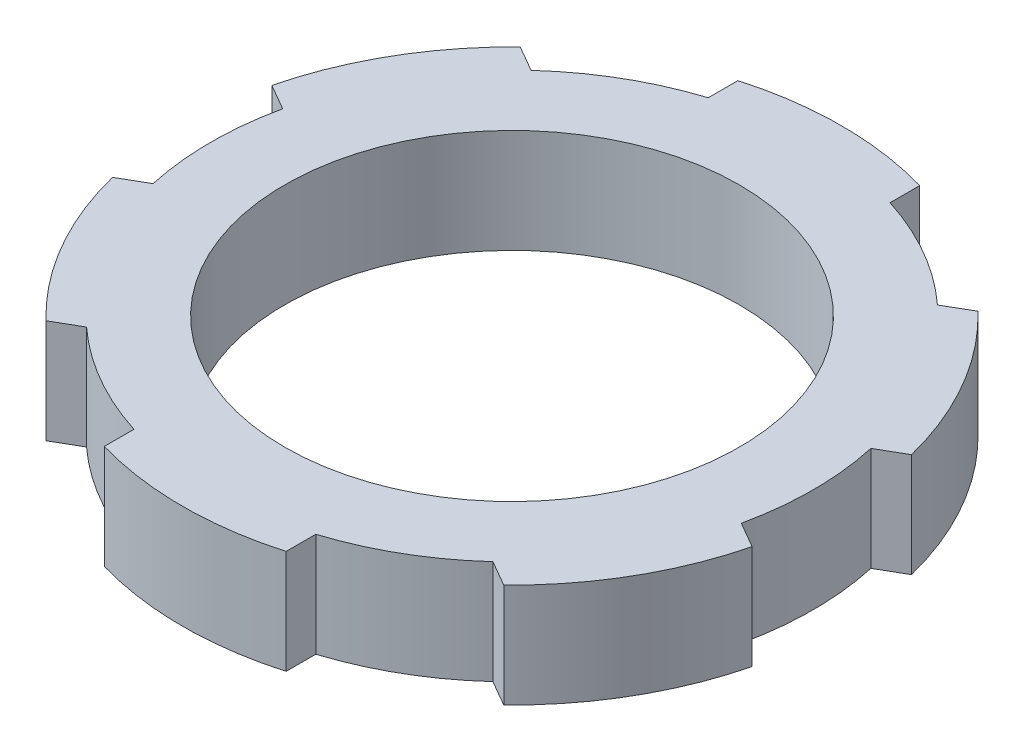
ISO-10303-21;
HEADER;
FILE_DESCRIPTION(('STEP AP214'),'2;1');
FILE_NAME('part.step','',(''),(''),'','','');
FILE_SCHEMA(('AUTOMOTIVE_DESIGN { 1 0 10303 214 1 1 1 1 }'));
ENDSEC;
DATA;
#1=APPLICATION_CONTEXT('core data for automotive mechanical design processes');
#2=APPLICATION_PROTOCOL_DEFINITION('international standard','automotive_design',2000,#1);
#3=PRODUCT_CONTEXT('',#1,'mechanical');
#4=PRODUCT('Part','Part','',(#3));
#5=PRODUCT_RELATED_PRODUCT_CATEGORY('part','',(#4));
#6=PRODUCT_DEFINITION_FORMATION('','',#4);
#7=PRODUCT_DEFINITION_CONTEXT('part definition',#1,'design');
#8=PRODUCT_DEFINITION('design','',#6,#7);
#9=PRODUCT_DEFINITION_SHAPE('','',#8);
#10=(LENGTH_UNIT() NAMED_UNIT(*) SI_UNIT(.MILLI.,.METRE.));
#11=(NAMED_UNIT(*) PLANE_ANGLE_UNIT() SI_UNIT($,.RADIAN.));
#12=(NAMED_UNIT(*) SI_UNIT($,.STERADIAN.) SOLID_ANGLE_UNIT());
#13=UNCERTAINTY_MEASURE_WITH_UNIT(LENGTH_MEASURE(1.E-05),#10,'distance_accuracy_value','');
#14=(GEOMETRIC_REPRESENTATION_CONTEXT(3) GLOBAL_UNCERTAINTY_ASSIGNED_CONTEXT((#13)) GLOBAL_UNIT_ASSIGNED_CONTEXT((#10,
#11,#12)) REPRESENTATION_CONTEXT('',''));
#15=CARTESIAN_POINT('',(0.,0.,0.));
#16=DIRECTION('',(0.,0.,1.));
#17=DIRECTION('',(1.,0.,0.));
#18=AXIS2_PLACEMENT_3D('',#15,#16,#17);
#19=CARTESIAN_POINT('',(0.,4.57199999999999,0.));
#20=DIRECTION('',(0.,-1.,0.));
#21=DIRECTION('',(0.,0.,-1.00000000000002));
#22=AXIS2_PLACEMENT_3D('',#19,#20,#21);
#23=CYLINDRICAL_SURFACE('',#22,13.25);
#24=CARTESIAN_POINT('',(0.,4.57199999999999,0.));
#25=DIRECTION('',(0.,1.,0.));
#26=DIRECTION('',(0.,0.,1.00000000000002));
#27=AXIS2_PLACEMENT_3D('',#24,#25,#26);
#28=CIRCLE('',#27,13.25);
#29=CARTESIAN_POINT('',(8.93946410936118,4.57199999999999,-9.78000416346832));
#30=VERTEX_POINT('',#29);
#31=CARTESIAN_POINT('',(4.00000000000025,4.57199999999999,-12.6318050966599));
#32=VERTEX_POINT('',#31);
#33=EDGE_CURVE('E46',#30,#32,#28,.T.);
#34=ORIENTED_EDGE('',*,*,#33,.F.);
#35=DIRECTION('',(0.,1.,0.));
#36=VECTOR('',#35,1.);
#37=CARTESIAN_POINT('',(8.93946410936118,-9.15394837083547,-9.78000416346832));
#38=LINE('',#37,#36);
#39=CARTESIAN_POINT('',(8.93946410936118,0.,-9.78000416346832));
#40=VERTEX_POINT('',#39);
#41=EDGE_CURVE('E230',#40,#30,#38,.T.);
#42=ORIENTED_EDGE('',*,*,#41,.F.);
#43=CARTESIAN_POINT('',(0.,0.,0.));
#44=DIRECTION('',(0.,1.,0.));
#45=DIRECTION('',(0.,0.,1.00000000000002));
#46=AXIS2_PLACEMENT_3D('',#43,#44,#45);
#47=CIRCLE('',#46,13.25);
#48=CARTESIAN_POINT('',(4.00000000000025,0.,-12.6318050966599));
#49=VERTEX_POINT('',#48);
#50=EDGE_CURVE('E364',#40,#49,#47,.T.);
#51=ORIENTED_EDGE('',*,*,#50,.T.);
#52=DIRECTION('',(0.,1.,0.));
#53=VECTOR('',#52,1.);
#54=CARTESIAN_POINT('',(4.00000000000025,-8.21523902250362,-12.6318050966599));
#55=LINE('',#54,#53);
#56=EDGE_CURVE('E350',#49,#32,#55,.T.);
#57=ORIENTED_EDGE('',*,*,#56,.T.);
#58=EDGE_LOOP('',(#34,#42,#51,#57));
#59=FACE_BOUND('',#58,.T.);
#60=ADVANCED_FACE('F36',(#59),#23,.T.);
#61=CARTESIAN_POINT('',(12.9394641093614,0.,2.85180093319193));
#62=VERTEX_POINT('',#61);
#63=CARTESIAN_POINT('',(12.9394641093613,0.,-2.8518009331929));
#64=VERTEX_POINT('',#63);
#65=EDGE_CURVE('E398',#62,#64,#47,.T.);
#66=ORIENTED_EDGE('',*,*,#65,.T.);
#67=DIRECTION('',(0.,1.,0.));
#68=VECTOR('',#67,1.);
#69=CARTESIAN_POINT('',(12.9394641093613,-9.15394837083547,-2.8518009331929));
#70=LINE('',#69,#68);
#71=CARTESIAN_POINT('',(12.9394641093613,4.57199999999999,-2.8518009331929));
#72=VERTEX_POINT('',#71);
#73=EDGE_CURVE('E60',#64,#72,#70,.T.);
#74=ORIENTED_EDGE('',*,*,#73,.T.);
#75=CARTESIAN_POINT('',(12.9394641093614,4.57199999999999,2.85180093319193));
#76=VERTEX_POINT('',#75);
#77=EDGE_CURVE('E223',#76,#72,#28,.T.);
#78=ORIENTED_EDGE('',*,*,#77,.F.);
#79=DIRECTION('',(0.,1.,0.));
#80=VECTOR('',#79,1.);
#81=CARTESIAN_POINT('',(12.9394641093614,-9.15394837083544,2.85180093319193));
#82=LINE('',#81,#80);
#83=EDGE_CURVE('E240',#62,#76,#82,.T.);
#84=ORIENTED_EDGE('',*,*,#83,.F.);
#85=EDGE_LOOP('',(#66,#74,#78,#84));
#86=FACE_BOUND('',#85,.T.);
#87=ADVANCED_FACE('F387',(#86),#23,.T.);
#88=CARTESIAN_POINT('',(4.00000000000005,0.,12.6318050966592));
#89=VERTEX_POINT('',#88);
#90=CARTESIAN_POINT('',(8.93946410936135,0.,9.78000416346757));
#91=VERTEX_POINT('',#90);
#92=EDGE_CURVE('E401',#89,#91,#47,.T.);
#93=ORIENTED_EDGE('',*,*,#92,.T.);
#94=DIRECTION('',(0.,1.,0.));
#95=VECTOR('',#94,1.);
#96=CARTESIAN_POINT('',(8.93946410936135,-9.15394837083544,9.78000416346757));
#97=LINE('',#96,#95);
#98=CARTESIAN_POINT('',(8.93946410936135,4.57199999999999,9.78000416346757));
#99=VERTEX_POINT('',#98);
#100=EDGE_CURVE('E250',#91,#99,#97,.T.);
#101=ORIENTED_EDGE('',*,*,#100,.T.);
#102=CARTESIAN_POINT('',(4.00000000000005,4.57199999999999,12.6318050966592));
#103=VERTEX_POINT('',#102);
#104=EDGE_CURVE('E441',#103,#99,#28,.T.);
#105=ORIENTED_EDGE('',*,*,#104,.F.);
#106=DIRECTION('',(0.,1.,0.));
#107=VECTOR('',#106,1.);
#108=CARTESIAN_POINT('',(4.00000000000005,-8.21523902250362,12.6318050966592));
#109=LINE('',#108,#107);
#110=EDGE_CURVE('E264',#89,#103,#109,.T.);
#111=ORIENTED_EDGE('',*,*,#110,.F.);
#112=EDGE_LOOP('',(#93,#101,#105,#111));
#113=FACE_BOUND('',#112,.T.);
#114=ADVANCED_FACE('F391',(#113),#23,.T.);
#115=CARTESIAN_POINT('',(-8.93946410936122,0.,9.78000416346746));
#116=VERTEX_POINT('',#115);
#117=CARTESIAN_POINT('',(-4.00000000000007,0.,12.6318050966598));
#118=VERTEX_POINT('',#117);
#119=EDGE_CURVE('E462',#116,#118,#47,.T.);
#120=ORIENTED_EDGE('',*,*,#119,.T.);
#121=DIRECTION('',(0.,1.,0.));
#122=VECTOR('',#121,1.);
#123=CARTESIAN_POINT('',(-4.00000000000007,-8.21523902250362,12.6318050966598));
#124=LINE('',#123,#122);
#125=CARTESIAN_POINT('',(-4.00000000000007,4.57199999999999,12.6318050966598));
#126=VERTEX_POINT('',#125);
#127=EDGE_CURVE('E275',#118,#126,#124,.T.);
#128=ORIENTED_EDGE('',*,*,#127,.T.);
#129=CARTESIAN_POINT('',(-8.93946410936122,4.57199999999999,9.78000416346746));
#130=VERTEX_POINT('',#129);
#131=EDGE_CURVE('E439',#130,#126,#28,.T.);
#132=ORIENTED_EDGE('',*,*,#131,.F.);
#133=DIRECTION('',(0.,1.,0.));
#134=VECTOR('',#133,1.);
#135=CARTESIAN_POINT('',(-8.93946410936122,-9.15394837083547,9.78000416346746));
#136=LINE('',#135,#134);
#137=EDGE_CURVE('E289',#116,#130,#136,.T.);
#138=ORIENTED_EDGE('',*,*,#137,.F.);
#139=EDGE_LOOP('',(#120,#128,#132,#138));
#140=FACE_BOUND('',#139,.T.);
#141=ADVANCED_FACE('F395',(#140),#23,.T.);
#142=CARTESIAN_POINT('',(-12.9394641093614,0.,-2.8518009331925));
#143=VERTEX_POINT('',#142);
#144=CARTESIAN_POINT('',(-12.9394641093614,0.,2.85180093319179));
#145=VERTEX_POINT('',#144);
#146=EDGE_CURVE('E436',#143,#145,#47,.T.);
#147=ORIENTED_EDGE('',*,*,#146,.T.);
#148=DIRECTION('',(0.,1.,0.));
#149=VECTOR('',#148,1.);
#150=CARTESIAN_POINT('',(-12.9394641093614,-9.15394837083547,2.85180093319186));
#151=LINE('',#150,#149);
#152=CARTESIAN_POINT('',(-12.9394641093614,4.57199999999999,2.85180093319179));
#153=VERTEX_POINT('',#152);
#154=EDGE_CURVE('E300',#145,#153,#151,.T.);
#155=ORIENTED_EDGE('',*,*,#154,.T.);
#156=CARTESIAN_POINT('',(-12.9394641093613,4.57199999999999,-2.85180093319252));
#157=VERTEX_POINT('',#156);
#158=EDGE_CURVE('E45',#157,#153,#28,.T.);
#159=ORIENTED_EDGE('',*,*,#158,.F.);
#160=DIRECTION('',(0.,1.,0.));
#161=VECTOR('',#160,1.);
#162=CARTESIAN_POINT('',(-12.9394641093614,-9.15394837083544,-2.8518009331925));
#163=LINE('',#162,#161);
#164=EDGE_CURVE('E314',#143,#157,#163,.T.);
#165=ORIENTED_EDGE('',*,*,#164,.F.);
#166=EDGE_LOOP('',(#147,#155,#159,#165));
#167=FACE_BOUND('',#166,.T.);
#168=ADVANCED_FACE('F383',(#167),#23,.T.);
#169=CARTESIAN_POINT('',(0.,4.57199999999999,0.));
#170=DIRECTION('',(0.,1.,0.));
#171=DIRECTION('',(0.,0.,1.00000000000002));
#172=AXIS2_PLACEMENT_3D('',#169,#170,#171);
#173=PLANE('',#172);
#174=CARTESIAN_POINT('',(-4.00000000000004,4.57199999999999,-12.6318050966608));
#175=VERTEX_POINT('',#174);
#176=CARTESIAN_POINT('',(-8.93946410936131,4.57199999999999,-9.78000416346794));
#177=VERTEX_POINT('',#176);
#178=EDGE_CURVE('E11',#175,#177,#28,.T.);
#179=ORIENTED_EDGE('',*,*,#178,.T.);
#180=DIRECTION('',(-0.866025403784457,0.,-0.500000000000007));
#181=VECTOR('',#180,1.);
#182=CARTESIAN_POINT('',(-10.0701077045735,4.57199999999999,-10.4327815475213));
#183=LINE('',#182,#181);
#184=CARTESIAN_POINT('',(-10.0701077045735,4.57199999999999,-10.4327815475213));
#185=VERTEX_POINT('',#184);
#186=EDGE_CURVE('E310',#177,#185,#183,.T.);
#187=ORIENTED_EDGE('',*,*,#186,.T.);
#188=CARTESIAN_POINT('',(0.,4.57199999999999,0.));
#189=DIRECTION('',(0.,1.,0.));
#190=DIRECTION('',(0.866025403784457,0.,0.500000000000007));
#191=AXIS2_PLACEMENT_3D('',#188,#189,#190);
#192=CIRCLE('',#191,14.5);
#193=CARTESIAN_POINT('',(-14.0701077045735,4.57199999999999,-3.50457831724585));
#194=VERTEX_POINT('',#193);
#195=EDGE_CURVE('E319',#185,#194,#192,.T.);
#196=ORIENTED_EDGE('',*,*,#195,.T.);
#197=DIRECTION('',(0.866025403784457,0.,0.500000000000007));
#198=VECTOR('',#197,1.);
#199=CARTESIAN_POINT('',(-12.9394641093614,4.57199999999999,-2.8518009331925));
#200=LINE('',#199,#198);
#201=EDGE_CURVE('E322',#194,#157,#200,.T.);
#202=ORIENTED_EDGE('',*,*,#201,.T.);
#203=ORIENTED_EDGE('',*,*,#158,.T.);
#204=DIRECTION('',(-0.866025403784455,0.,0.500000000000013));
#205=VECTOR('',#204,1.);
#206=CARTESIAN_POINT('',(-14.0701077045736,4.57199999999999,3.50457831724542));
#207=LINE('',#206,#205);
#208=CARTESIAN_POINT('',(-14.0701077045736,4.57199999999999,3.50457831724542));
#209=VERTEX_POINT('',#208);
#210=EDGE_CURVE('E285',#153,#209,#207,.T.);
#211=ORIENTED_EDGE('',*,*,#210,.T.);
#212=CARTESIAN_POINT('',(0.,4.57199999999999,0.));
#213=DIRECTION('',(0.,1.,0.));
#214=DIRECTION('',(0.866025403784455,0.,-0.500000000000013));
#215=AXIS2_PLACEMENT_3D('',#212,#213,#214);
#216=CIRCLE('',#215,14.5);
#217=CARTESIAN_POINT('',(-10.0701077045734,4.57199999999999,10.4327815475207));
#218=VERTEX_POINT('',#217);
#219=EDGE_CURVE('E294',#209,#218,#216,.T.);
#220=ORIENTED_EDGE('',*,*,#219,.T.);
#221=DIRECTION('',(0.866025403784455,0.,-0.500000000000013));
#222=VECTOR('',#221,1.);
#223=CARTESIAN_POINT('',(-8.93946410936122,4.57199999999999,9.78000416346746));
#224=LINE('',#223,#222);
#225=EDGE_CURVE('E297',#218,#130,#224,.T.);
#226=ORIENTED_EDGE('',*,*,#225,.T.);
#227=ORIENTED_EDGE('',*,*,#131,.T.);
#228=DIRECTION('',(0.,0.,1.00000000000002));
#229=VECTOR('',#228,1.);
#230=CARTESIAN_POINT('',(-4.00000000000007,4.57199999999999,13.9373598647661));
#231=LINE('',#230,#229);
#232=CARTESIAN_POINT('',(-4.00000000000007,4.57199999999999,13.9373598647661));
#233=VERTEX_POINT('',#232);
#234=EDGE_CURVE('E260',#126,#233,#231,.T.);
#235=ORIENTED_EDGE('',*,*,#234,.T.);
#236=CARTESIAN_POINT('',(0.,4.57199999999999,0.));
#237=DIRECTION('',(0.,1.,0.));
#238=DIRECTION('',(0.,0.,-1.00000000000002));
#239=AXIS2_PLACEMENT_3D('',#236,#237,#238);
#240=CIRCLE('',#239,14.5);
#241=CARTESIAN_POINT('',(4.00000000000032,4.57199999999999,13.9373598647662));
#242=VERTEX_POINT('',#241);
#243=EDGE_CURVE('E269',#233,#242,#240,.T.);
#244=ORIENTED_EDGE('',*,*,#243,.T.);
#245=DIRECTION('',(0.,0.,-1.00000000000002));
#246=VECTOR('',#245,1.);
#247=CARTESIAN_POINT('',(4.00000000000005,4.57199999999999,12.6318050966592));
#248=LINE('',#247,#246);
#249=EDGE_CURVE('E272',#242,#103,#248,.T.);
#250=ORIENTED_EDGE('',*,*,#249,.T.);
#251=ORIENTED_EDGE('',*,*,#104,.T.);
#252=DIRECTION('',(0.86602540378446,0.,0.5));
#253=VECTOR('',#252,1.);
#254=CARTESIAN_POINT('',(10.0701077045738,4.57199999999999,10.4327815475208));
#255=LINE('',#254,#253);
#256=CARTESIAN_POINT('',(10.0701077045738,4.57199999999999,10.4327815475208));
#257=VERTEX_POINT('',#256);
#258=EDGE_CURVE('E236',#99,#257,#255,.T.);
#259=ORIENTED_EDGE('',*,*,#258,.T.);
#260=CARTESIAN_POINT('',(0.,4.57199999999999,0.));
#261=DIRECTION('',(0.,1.,0.));
#262=DIRECTION('',(-0.86602540378446,0.,-0.5));
#263=AXIS2_PLACEMENT_3D('',#260,#261,#262);
#264=CIRCLE('',#263,14.5);
#265=CARTESIAN_POINT('',(14.0701077045736,4.57199999999999,3.504578317245));
#266=VERTEX_POINT('',#265);
#267=EDGE_CURVE('E245',#257,#266,#264,.T.);
#268=ORIENTED_EDGE('',*,*,#267,.T.);
#269=DIRECTION('',(-0.86602540378446,0.,-0.5));
#270=VECTOR('',#269,1.);
#271=CARTESIAN_POINT('',(12.9394641093614,4.57199999999999,2.85180093319193));
#272=LINE('',#271,#270);
#273=EDGE_CURVE('E248',#266,#76,#272,.T.);
#274=ORIENTED_EDGE('',*,*,#273,.T.);
#275=ORIENTED_EDGE('',*,*,#77,.T.);
#276=DIRECTION('',(0.866025403784451,0.,-0.50000000000002));
#277=VECTOR('',#276,1.);
#278=CARTESIAN_POINT('',(14.0701077045735,4.57199999999999,-3.50457831724599));
#279=LINE('',#278,#277);
#280=CARTESIAN_POINT('',(14.0701077045736,4.57199999999999,-3.50457831724602));
#281=VERTEX_POINT('',#280);
#282=EDGE_CURVE('E204',#72,#281,#279,.T.);
#283=ORIENTED_EDGE('',*,*,#282,.T.);
#284=CARTESIAN_POINT('',(0.,4.57199999999999,0.));
#285=DIRECTION('',(0.,1.,0.));
#286=DIRECTION('',(-0.866025403784451,0.,0.50000000000002));
#287=AXIS2_PLACEMENT_3D('',#284,#285,#286);
#288=CIRCLE('',#287,14.5);
#289=CARTESIAN_POINT('',(10.0701077045734,4.57199999999999,-10.4327815475215));
#290=VERTEX_POINT('',#289);
#291=EDGE_CURVE('E212',#281,#290,#288,.T.);
#292=ORIENTED_EDGE('',*,*,#291,.T.);
#293=DIRECTION('',(-0.866025403784451,0.,0.50000000000002));
#294=VECTOR('',#293,1.);
#295=CARTESIAN_POINT('',(8.93946410936118,4.57199999999999,-9.78000416346832));
#296=LINE('',#295,#294);
#297=EDGE_CURVE('E218',#290,#30,#296,.T.);
#298=ORIENTED_EDGE('',*,*,#297,.T.);
#299=ORIENTED_EDGE('',*,*,#33,.T.);
#300=DIRECTION('',(0.,0.,-1.00000000000002));
#301=VECTOR('',#300,1.);
#302=CARTESIAN_POINT('',(4.00000000000011,4.57199999999999,-13.9373598647665));
#303=LINE('',#302,#301);
#304=CARTESIAN_POINT('',(4.00000000000011,4.57199999999999,-13.9373598647665));
#305=VERTEX_POINT('',#304);
#306=EDGE_CURVE('E335',#32,#305,#303,.T.);
#307=ORIENTED_EDGE('',*,*,#306,.T.);
#308=CARTESIAN_POINT('',(0.,4.57199999999999,0.));
#309=DIRECTION('',(0.,1.,0.));
#310=DIRECTION('',(0.,0.,1.00000000000002));
#311=AXIS2_PLACEMENT_3D('',#308,#309,#310);
#312=CIRCLE('',#311,14.5);
#313=CARTESIAN_POINT('',(-3.99999999999999,4.57199999999999,-13.9373598647675));
#314=VERTEX_POINT('',#313);
#315=EDGE_CURVE('E344',#305,#314,#312,.T.);
#316=ORIENTED_EDGE('',*,*,#315,.T.);
#317=DIRECTION('',(0.,0.,1.00000000000002));
#318=VECTOR('',#317,1.);
#319=CARTESIAN_POINT('',(-4.00000000000004,4.57199999999999,-12.6318050966608));
#320=LINE('',#319,#318);
#321=EDGE_CURVE('E347',#314,#175,#320,.T.);
#322=ORIENTED_EDGE('',*,*,#321,.T.);
#323=EDGE_LOOP('',(#179,#187,#196,#202,#203,#211,#220,#226,#227,#235,#244,#250,#251,#259,#268,
#274,#275,#283,#292,#298,#299,#307,#316,#322));
#324=FACE_BOUND('',#323,.T.);
#325=CARTESIAN_POINT('',(0.,4.57199999999999,0.));
#326=DIRECTION('',(0.,1.,0.));
#327=DIRECTION('',(0.,0.,1.00000000000002));
#328=AXIS2_PLACEMENT_3D('',#325,#326,#327);
#329=CIRCLE('',#328,10.);
#330=CARTESIAN_POINT('',(0.,4.57199999999999,10.0000000000002));
#331=VERTEX_POINT('',#330);
#332=EDGE_CURVE('E361',#331,#331,#329,.T.);
#333=ORIENTED_EDGE('',*,*,#332,.F.);
#334=EDGE_LOOP('',(#333));
#335=FACE_BOUND('',#334,.T.);
#336=ADVANCED_FACE('F220',(#324,#335),#173,.T.);
#337=CARTESIAN_POINT('',(0.,0.,0.));
#338=DIRECTION('',(0.,1.,0.));
#339=DIRECTION('',(0.,0.,1.00000000000002));
#340=AXIS2_PLACEMENT_3D('',#337,#338,#339);
#341=PLANE('',#340);
#342=CARTESIAN_POINT('',(-4.00000000000004,0.,-12.6318050966608));
#343=VERTEX_POINT('',#342);
#344=CARTESIAN_POINT('',(-8.93946410936131,0.,-9.78000416346794));
#345=VERTEX_POINT('',#344);
#346=EDGE_CURVE('E40',#343,#345,#47,.T.);
#347=ORIENTED_EDGE('',*,*,#346,.F.);
#348=DIRECTION('',(0.,0.,-1.00000000000002));
#349=VECTOR('',#348,1.);
#350=CARTESIAN_POINT('',(-4.00000000000004,0.,-12.6318050966608));
#351=LINE('',#350,#349);
#352=CARTESIAN_POINT('',(-3.99999999999999,0.,-13.9373598647675));
#353=VERTEX_POINT('',#352);
#354=EDGE_CURVE('E338',#343,#353,#351,.T.);
#355=ORIENTED_EDGE('',*,*,#354,.T.);
#356=CARTESIAN_POINT('',(0.,0.,0.));
#357=DIRECTION('',(0.,1.,0.));
#358=DIRECTION('',(0.,0.,1.00000000000002));
#359=AXIS2_PLACEMENT_3D('',#356,#357,#358);
#360=CIRCLE('',#359,14.5);
#361=CARTESIAN_POINT('',(4.00000000000011,0.,-13.9373598647665));
#362=VERTEX_POINT('',#361);
#363=EDGE_CURVE('E336',#353,#362,#360,.F.);
#364=ORIENTED_EDGE('',*,*,#363,.T.);
#365=DIRECTION('',(0.,0.,1.00000000000002));
#366=VECTOR('',#365,1.);
#367=CARTESIAN_POINT('',(4.00000000000011,0.,-13.9373598647665));
#368=LINE('',#367,#366);
#369=EDGE_CURVE('E341',#362,#49,#368,.T.);
#370=ORIENTED_EDGE('',*,*,#369,.T.);
#371=ORIENTED_EDGE('',*,*,#50,.F.);
#372=DIRECTION('',(0.866025403784451,0.,-0.50000000000002));
#373=VECTOR('',#372,1.);
#374=CARTESIAN_POINT('',(8.93946410936118,0.,-9.78000416346832));
#375=LINE('',#374,#373);
#376=CARTESIAN_POINT('',(10.0701077045734,0.,-10.4327815475215));
#377=VERTEX_POINT('',#376);
#378=EDGE_CURVE('E226',#40,#377,#375,.T.);
#379=ORIENTED_EDGE('',*,*,#378,.T.);
#380=CARTESIAN_POINT('',(0.,0.,0.));
#381=DIRECTION('',(0.,1.,0.));
#382=DIRECTION('',(0.,0.,1.00000000000002));
#383=AXIS2_PLACEMENT_3D('',#380,#381,#382);
#384=CIRCLE('',#383,14.5);
#385=CARTESIAN_POINT('',(14.0701077045736,0.,-3.50457831724602));
#386=VERTEX_POINT('',#385);
#387=EDGE_CURVE('E232',#377,#386,#384,.F.);
#388=ORIENTED_EDGE('',*,*,#387,.T.);
#389=DIRECTION('',(-0.866025403784451,0.,0.50000000000002));
#390=VECTOR('',#389,1.);
#391=CARTESIAN_POINT('',(14.0701077045735,0.,-3.50457831724599));
#392=LINE('',#391,#390);
#393=EDGE_CURVE('E206',#386,#64,#392,.T.);
#394=ORIENTED_EDGE('',*,*,#393,.T.);
#395=ORIENTED_EDGE('',*,*,#65,.F.);
#396=DIRECTION('',(0.86602540378446,0.,0.500000000000001));
#397=VECTOR('',#396,1.);
#398=CARTESIAN_POINT('',(12.9394641093614,0.,2.85180093319193));
#399=LINE('',#398,#397);
#400=CARTESIAN_POINT('',(14.0701077045736,0.,3.504578317245));
#401=VERTEX_POINT('',#400);
#402=EDGE_CURVE('E239',#62,#401,#399,.T.);
#403=ORIENTED_EDGE('',*,*,#402,.T.);
#404=CARTESIAN_POINT('',(0.,0.,0.));
#405=DIRECTION('',(0.,1.,0.));
#406=DIRECTION('',(0.,0.,1.00000000000002));
#407=AXIS2_PLACEMENT_3D('',#404,#405,#406);
#408=CIRCLE('',#407,14.5);
#409=CARTESIAN_POINT('',(10.0701077045738,0.,10.4327815475208));
#410=VERTEX_POINT('',#409);
#411=EDGE_CURVE('E237',#401,#410,#408,.F.);
#412=ORIENTED_EDGE('',*,*,#411,.T.);
#413=DIRECTION('',(-0.86602540378446,0.,-0.500000000000001));
#414=VECTOR('',#413,1.);
#415=CARTESIAN_POINT('',(10.0701077045738,0.,10.4327815475208));
#416=LINE('',#415,#414);
#417=EDGE_CURVE('E242',#410,#91,#416,.T.);
#418=ORIENTED_EDGE('',*,*,#417,.T.);
#419=ORIENTED_EDGE('',*,*,#92,.F.);
#420=DIRECTION('',(0.,0.,1.00000000000002));
#421=VECTOR('',#420,1.);
#422=CARTESIAN_POINT('',(4.00000000000005,0.,12.6318050966592));
#423=LINE('',#422,#421);
#424=CARTESIAN_POINT('',(4.00000000000032,0.,13.9373598647662));
#425=VERTEX_POINT('',#424);
#426=EDGE_CURVE('E263',#89,#425,#423,.T.);
#427=ORIENTED_EDGE('',*,*,#426,.T.);
#428=CARTESIAN_POINT('',(0.,0.,0.));
#429=DIRECTION('',(0.,1.,0.));
#430=DIRECTION('',(0.,0.,1.00000000000002));
#431=AXIS2_PLACEMENT_3D('',#428,#429,#430);
#432=CIRCLE('',#431,14.5);
#433=CARTESIAN_POINT('',(-4.00000000000007,0.,13.9373598647661));
#434=VERTEX_POINT('',#433);
#435=EDGE_CURVE('E261',#425,#434,#432,.F.);
#436=ORIENTED_EDGE('',*,*,#435,.T.);
#437=DIRECTION('',(0.,0.,-1.00000000000002));
#438=VECTOR('',#437,1.);
#439=CARTESIAN_POINT('',(-4.00000000000007,0.,13.9373598647661));
#440=LINE('',#439,#438);
#441=EDGE_CURVE('E266',#434,#118,#440,.T.);
#442=ORIENTED_EDGE('',*,*,#441,.T.);
#443=ORIENTED_EDGE('',*,*,#119,.F.);
#444=DIRECTION('',(-0.866025403784455,0.,0.500000000000013));
#445=VECTOR('',#444,1.);
#446=CARTESIAN_POINT('',(-8.93946410936122,0.,9.78000416346746));
#447=LINE('',#446,#445);
#448=CARTESIAN_POINT('',(-10.0701077045734,0.,10.4327815475207));
#449=VERTEX_POINT('',#448);
#450=EDGE_CURVE('E288',#116,#449,#447,.T.);
#451=ORIENTED_EDGE('',*,*,#450,.T.);
#452=CARTESIAN_POINT('',(0.,0.,0.));
#453=DIRECTION('',(0.,1.,0.));
#454=DIRECTION('',(0.,0.,1.00000000000002));
#455=AXIS2_PLACEMENT_3D('',#452,#453,#454);
#456=CIRCLE('',#455,14.5);
#457=CARTESIAN_POINT('',(-14.0701077045736,0.,3.50457831724542));
#458=VERTEX_POINT('',#457);
#459=EDGE_CURVE('E286',#449,#458,#456,.F.);
#460=ORIENTED_EDGE('',*,*,#459,.T.);
#461=DIRECTION('',(0.866025403784455,0.,-0.500000000000013));
#462=VECTOR('',#461,1.);
#463=CARTESIAN_POINT('',(-14.0701077045736,0.,3.50457831724542));
#464=LINE('',#463,#462);
#465=EDGE_CURVE('E291',#458,#145,#464,.T.);
#466=ORIENTED_EDGE('',*,*,#465,.T.);
#467=ORIENTED_EDGE('',*,*,#146,.F.);
#468=DIRECTION('',(-0.866025403784458,0.,-0.500000000000007));
#469=VECTOR('',#468,1.);
#470=CARTESIAN_POINT('',(-12.9394641093614,0.,-2.8518009331925));
#471=LINE('',#470,#469);
#472=CARTESIAN_POINT('',(-14.0701077045735,0.,-3.50457831724585));
#473=VERTEX_POINT('',#472);
#474=EDGE_CURVE('E313',#143,#473,#471,.T.);
#475=ORIENTED_EDGE('',*,*,#474,.T.);
#476=CARTESIAN_POINT('',(0.,0.,0.));
#477=DIRECTION('',(0.,1.,0.));
#478=DIRECTION('',(0.,0.,1.00000000000002));
#479=AXIS2_PLACEMENT_3D('',#476,#477,#478);
#480=CIRCLE('',#479,14.5);
#481=CARTESIAN_POINT('',(-10.0701077045735,0.,-10.4327815475213));
#482=VERTEX_POINT('',#481);
#483=EDGE_CURVE('E311',#473,#482,#480,.F.);
#484=ORIENTED_EDGE('',*,*,#483,.T.);
#485=DIRECTION('',(0.866025403784458,0.,0.500000000000007));
#486=VECTOR('',#485,1.);
#487=CARTESIAN_POINT('',(-10.0701077045735,0.,-10.4327815475213));
#488=LINE('',#487,#486);
#489=EDGE_CURVE('E316',#482,#345,#488,.T.);
#490=ORIENTED_EDGE('',*,*,#489,.T.);
#491=EDGE_LOOP('',(#347,#355,#364,#370,#371,#379,#388,#394,#395,#403,#412,#418,#419,#427,#436,
#442,#443,#451,#460,#466,#467,#475,#484,#490));
#492=FACE_BOUND('',#491,.T.);
#493=CARTESIAN_POINT('',(0.,0.,0.));
#494=DIRECTION('',(0.,1.,0.));
#495=DIRECTION('',(0.,0.,1.00000000000002));
#496=AXIS2_PLACEMENT_3D('',#493,#494,#495);
#497=CIRCLE('',#496,10.);
#498=CARTESIAN_POINT('',(0.,0.,10.0000000000002));
#499=VERTEX_POINT('',#498);
#500=EDGE_CURVE('E360',#499,#499,#497,.T.);
#501=ORIENTED_EDGE('',*,*,#500,.T.);
#502=EDGE_LOOP('',(#501));
#503=FACE_BOUND('',#502,.T.);
#504=ADVANCED_FACE('F368',(#492,#503),#341,.F.);
#505=ORIENTED_EDGE('',*,*,#346,.T.);
#506=DIRECTION('',(0.,1.,0.));
#507=VECTOR('',#506,1.);
#508=CARTESIAN_POINT('',(-8.93946410936131,-9.15394837083544,-9.78000416346794));
#509=LINE('',#508,#507);
#510=EDGE_CURVE('E325',#345,#177,#509,.T.);
#511=ORIENTED_EDGE('',*,*,#510,.T.);
#512=ORIENTED_EDGE('',*,*,#178,.F.);
#513=DIRECTION('',(0.,1.,0.));
#514=VECTOR('',#513,1.);
#515=CARTESIAN_POINT('',(-4.00000000000004,-8.21523902250362,-12.6318050966608));
#516=LINE('',#515,#514);
#517=EDGE_CURVE('E339',#343,#175,#516,.T.);
#518=ORIENTED_EDGE('',*,*,#517,.F.);
#519=EDGE_LOOP('',(#505,#511,#512,#518));
#520=FACE_BOUND('',#519,.T.);
#521=ADVANCED_FACE('F38',(#520),#23,.T.);
#522=CARTESIAN_POINT('',(0.,4.57199999999999,0.));
#523=DIRECTION('',(0.,-1.,0.));
#524=DIRECTION('',(0.,0.,-1.00000000000002));
#525=AXIS2_PLACEMENT_3D('',#522,#523,#524);
#526=CYLINDRICAL_SURFACE('',#525,10.);
#527=ORIENTED_EDGE('',*,*,#332,.T.);
#528=EDGE_LOOP('',(#527));
#529=FACE_BOUND('',#528,.T.);
#530=ORIENTED_EDGE('',*,*,#500,.F.);
#531=EDGE_LOOP('',(#530));
#532=FACE_BOUND('',#531,.T.);
#533=ADVANCED_FACE('F370',(#529,#532),#526,.F.);
#534=CARTESIAN_POINT('',(-4.00000000000004,-8.21523902250362,-12.6318050966608));
#535=DIRECTION('',(-1.00000000000002,0.,0.));
#536=DIRECTION('',(0.,0.,1.00000000000002));
#537=AXIS2_PLACEMENT_3D('',#534,#535,#536);
#538=PLANE('',#537);
#539=ORIENTED_EDGE('',*,*,#354,.F.);
#540=ORIENTED_EDGE('',*,*,#517,.T.);
#541=ORIENTED_EDGE('',*,*,#321,.F.);
#542=DIRECTION('',(0.,1.,0.));
#543=VECTOR('',#542,1.);
#544=CARTESIAN_POINT('',(-3.99999999999999,-8.21523902250362,-13.9373598647675));
#545=LINE('',#544,#543);
#546=EDGE_CURVE('E353',#353,#314,#545,.T.);
#547=ORIENTED_EDGE('',*,*,#546,.F.);
#548=EDGE_LOOP('',(#539,#540,#541,#547));
#549=FACE_BOUND('',#548,.T.);
#550=ADVANCED_FACE('F372',(#549),#538,.T.);
#551=CARTESIAN_POINT('',(0.,-8.21523902250362,0.));
#552=DIRECTION('',(0.,1.,0.));
#553=DIRECTION('',(0.,0.,1.00000000000002));
#554=AXIS2_PLACEMENT_3D('',#551,#552,#553);
#555=CYLINDRICAL_SURFACE('',#554,14.5);
#556=ORIENTED_EDGE('',*,*,#363,.F.);
#557=ORIENTED_EDGE('',*,*,#546,.T.);
#558=ORIENTED_EDGE('',*,*,#315,.F.);
#559=DIRECTION('',(0.,1.,0.));
#560=VECTOR('',#559,1.);
#561=CARTESIAN_POINT('',(4.00000000000011,-8.21523902250362,-13.9373598647665));
#562=LINE('',#561,#560);
#563=EDGE_CURVE('E355',#362,#305,#562,.T.);
#564=ORIENTED_EDGE('',*,*,#563,.F.);
#565=EDGE_LOOP('',(#556,#557,#558,#564));
#566=FACE_BOUND('',#565,.T.);
#567=ADVANCED_FACE('F379',(#566),#555,.T.);
#568=CARTESIAN_POINT('',(4.00000000000011,-8.21523902250362,-13.9373598647665));
#569=DIRECTION('',(1.00000000000002,0.,0.));
#570=DIRECTION('',(0.,0.,-1.00000000000002));
#571=AXIS2_PLACEMENT_3D('',#568,#569,#570);
#572=PLANE('',#571);
#573=ORIENTED_EDGE('',*,*,#369,.F.);
#574=ORIENTED_EDGE('',*,*,#563,.T.);
#575=ORIENTED_EDGE('',*,*,#306,.F.);
#576=ORIENTED_EDGE('',*,*,#56,.F.);
#577=EDGE_LOOP('',(#573,#574,#575,#576));
#578=FACE_BOUND('',#577,.T.);
#579=ADVANCED_FACE('F409',(#578),#572,.T.);
#580=CARTESIAN_POINT('',(-12.9394641093614,-9.15394837083544,-2.8518009331925));
#581=DIRECTION('',(-0.500000000000007,0.,0.866025403784458));
#582=DIRECTION('',(0.866025403784458,0.,0.500000000000007));
#583=AXIS2_PLACEMENT_3D('',#580,#581,#582);
#584=PLANE('',#583);
#585=ORIENTED_EDGE('',*,*,#474,.F.);
#586=ORIENTED_EDGE('',*,*,#164,.T.);
#587=ORIENTED_EDGE('',*,*,#201,.F.);
#588=DIRECTION('',(0.,1.,0.));
#589=VECTOR('',#588,1.);
#590=CARTESIAN_POINT('',(-14.0701077045735,-9.15394837083544,-3.50457831724585));
#591=LINE('',#590,#589);
#592=EDGE_CURVE('E328',#473,#194,#591,.T.);
#593=ORIENTED_EDGE('',*,*,#592,.F.);
#594=EDGE_LOOP('',(#585,#586,#587,#593));
#595=FACE_BOUND('',#594,.T.);
#596=ADVANCED_FACE('F433',(#595),#584,.T.);
#597=CARTESIAN_POINT('',(0.,-9.15394837083544,0.));
#598=DIRECTION('',(0.,1.,0.));
#599=DIRECTION('',(0.,0.,1.00000000000002));
#600=AXIS2_PLACEMENT_3D('',#597,#598,#599);
#601=CYLINDRICAL_SURFACE('',#600,14.5);
#602=ORIENTED_EDGE('',*,*,#483,.F.);
#603=ORIENTED_EDGE('',*,*,#592,.T.);
#604=ORIENTED_EDGE('',*,*,#195,.F.);
#605=DIRECTION('',(0.,1.,0.));
#606=VECTOR('',#605,1.);
#607=CARTESIAN_POINT('',(-10.0701077045735,-9.15394837083544,-10.4327815475213));
#608=LINE('',#607,#606);
#609=EDGE_CURVE('E330',#482,#185,#608,.T.);
#610=ORIENTED_EDGE('',*,*,#609,.F.);
#611=EDGE_LOOP('',(#602,#603,#604,#610));
#612=FACE_BOUND('',#611,.T.);
#613=ADVANCED_FACE('F427',(#612),#601,.T.);
#614=CARTESIAN_POINT('',(-10.0701077045735,-9.15394837083544,-10.4327815475213));
#615=DIRECTION('',(0.500000000000007,0.,-0.866025403784458));
#616=DIRECTION('',(-0.866025403784458,0.,-0.500000000000007));
#617=AXIS2_PLACEMENT_3D('',#614,#615,#616);
#618=PLANE('',#617);
#619=ORIENTED_EDGE('',*,*,#489,.F.);
#620=ORIENTED_EDGE('',*,*,#609,.T.);
#621=ORIENTED_EDGE('',*,*,#186,.F.);
#622=ORIENTED_EDGE('',*,*,#510,.F.);
#623=EDGE_LOOP('',(#619,#620,#621,#622));
#624=FACE_BOUND('',#623,.T.);
#625=ADVANCED_FACE('F422',(#624),#618,.T.);
#626=CARTESIAN_POINT('',(-8.93946410936122,-9.15394837083547,9.78000416346746));
#627=DIRECTION('',(0.500000000000013,0.,0.866025403784454));
#628=DIRECTION('',(0.866025403784455,0.,-0.500000000000013));
#629=AXIS2_PLACEMENT_3D('',#626,#627,#628);
#630=PLANE('',#629);
#631=ORIENTED_EDGE('',*,*,#450,.F.);
#632=ORIENTED_EDGE('',*,*,#137,.T.);
#633=ORIENTED_EDGE('',*,*,#225,.F.);
#634=DIRECTION('',(0.,1.,0.));
#635=VECTOR('',#634,1.);
#636=CARTESIAN_POINT('',(-10.0701077045734,-9.15394837083547,10.4327815475207));
#637=LINE('',#636,#635);
#638=EDGE_CURVE('E303',#449,#218,#637,.T.);
#639=ORIENTED_EDGE('',*,*,#638,.F.);
#640=EDGE_LOOP('',(#631,#632,#633,#639));
#641=FACE_BOUND('',#640,.T.);
#642=ADVANCED_FACE('F481',(#641),#630,.T.);
#643=CARTESIAN_POINT('',(0.,-9.15394837083547,0.));
#644=DIRECTION('',(0.,1.,0.));
#645=DIRECTION('',(0.,0.,1.00000000000002));
#646=AXIS2_PLACEMENT_3D('',#643,#644,#645);
#647=CYLINDRICAL_SURFACE('',#646,14.5);
#648=ORIENTED_EDGE('',*,*,#459,.F.);
#649=ORIENTED_EDGE('',*,*,#638,.T.);
#650=ORIENTED_EDGE('',*,*,#219,.F.);
#651=DIRECTION('',(0.,1.,0.));
#652=VECTOR('',#651,1.);
#653=CARTESIAN_POINT('',(-14.0701077045736,-9.15394837083547,3.50457831724542));
#654=LINE('',#653,#652);
#655=EDGE_CURVE('E305',#458,#209,#654,.T.);
#656=ORIENTED_EDGE('',*,*,#655,.F.);
#657=EDGE_LOOP('',(#648,#649,#650,#656));
#658=FACE_BOUND('',#657,.T.);
#659=ADVANCED_FACE('F484',(#658),#647,.T.);
#660=CARTESIAN_POINT('',(-14.0701077045736,-9.15394837083547,3.50457831724542));
#661=DIRECTION('',(-0.500000000000013,0.,-0.866025403784454));
#662=DIRECTION('',(-0.866025403784455,0.,0.500000000000013));
#663=AXIS2_PLACEMENT_3D('',#660,#661,#662);
#664=PLANE('',#663);
#665=ORIENTED_EDGE('',*,*,#465,.F.);
#666=ORIENTED_EDGE('',*,*,#655,.T.);
#667=ORIENTED_EDGE('',*,*,#210,.F.);
#668=ORIENTED_EDGE('',*,*,#154,.F.);
#669=EDGE_LOOP('',(#665,#666,#667,#668));
#670=FACE_BOUND('',#669,.T.);
#671=ADVANCED_FACE('F488',(#670),#664,.T.);
#672=CARTESIAN_POINT('',(4.00000000000005,-8.21523902250362,12.6318050966592));
#673=DIRECTION('',(1.00000000000002,0.,0.));
#674=DIRECTION('',(0.,0.,-1.00000000000002));
#675=AXIS2_PLACEMENT_3D('',#672,#673,#674);
#676=PLANE('',#675);
#677=ORIENTED_EDGE('',*,*,#426,.F.);
#678=ORIENTED_EDGE('',*,*,#110,.T.);
#679=ORIENTED_EDGE('',*,*,#249,.F.);
#680=DIRECTION('',(0.,1.,0.));
#681=VECTOR('',#680,1.);
#682=CARTESIAN_POINT('',(4.00000000000032,-8.21523902250362,13.9373598647662));
#683=LINE('',#682,#681);
#684=EDGE_CURVE('E278',#425,#242,#683,.T.);
#685=ORIENTED_EDGE('',*,*,#684,.F.);
#686=EDGE_LOOP('',(#677,#678,#679,#685));
#687=FACE_BOUND('',#686,.T.);
#688=ADVANCED_FACE('F465',(#687),#676,.T.);
#689=CARTESIAN_POINT('',(0.,-8.21523902250362,0.));
#690=DIRECTION('',(0.,1.,0.));
#691=DIRECTION('',(0.,0.,1.00000000000002));
#692=AXIS2_PLACEMENT_3D('',#689,#690,#691);
#693=CYLINDRICAL_SURFACE('',#692,14.5);
#694=ORIENTED_EDGE('',*,*,#435,.F.);
#695=ORIENTED_EDGE('',*,*,#684,.T.);
#696=ORIENTED_EDGE('',*,*,#243,.F.);
#697=DIRECTION('',(0.,1.,0.));
#698=VECTOR('',#697,1.);
#699=CARTESIAN_POINT('',(-4.00000000000007,-8.21523902250362,13.9373598647661));
#700=LINE('',#699,#698);
#701=EDGE_CURVE('E280',#434,#233,#700,.T.);
#702=ORIENTED_EDGE('',*,*,#701,.F.);
#703=EDGE_LOOP('',(#694,#695,#696,#702));
#704=FACE_BOUND('',#703,.T.);
#705=ADVANCED_FACE('F468',(#704),#693,.T.);
#706=CARTESIAN_POINT('',(-4.00000000000007,-8.21523902250362,13.9373598647661));
#707=DIRECTION('',(-1.00000000000002,0.,0.));
#708=DIRECTION('',(0.,0.,1.00000000000002));
#709=AXIS2_PLACEMENT_3D('',#706,#707,#708);
#710=PLANE('',#709);
#711=ORIENTED_EDGE('',*,*,#441,.F.);
#712=ORIENTED_EDGE('',*,*,#701,.T.);
#713=ORIENTED_EDGE('',*,*,#234,.F.);
#714=ORIENTED_EDGE('',*,*,#127,.F.);
#715=EDGE_LOOP('',(#711,#712,#713,#714));
#716=FACE_BOUND('',#715,.T.);
#717=ADVANCED_FACE('F473',(#716),#710,.T.);
#718=CARTESIAN_POINT('',(12.9394641093614,-9.15394837083544,2.85180093319193));
#719=DIRECTION('',(0.5,0.,-0.86602540378446));
#720=DIRECTION('',(-0.86602540378446,0.,-0.500000000000001));
#721=AXIS2_PLACEMENT_3D('',#718,#719,#720);
#722=PLANE('',#721);
#723=ORIENTED_EDGE('',*,*,#402,.F.);
#724=ORIENTED_EDGE('',*,*,#83,.T.);
#725=ORIENTED_EDGE('',*,*,#273,.F.);
#726=DIRECTION('',(0.,1.,0.));
#727=VECTOR('',#726,1.);
#728=CARTESIAN_POINT('',(14.0701077045736,-9.15394837083544,3.504578317245));
#729=LINE('',#728,#727);
#730=EDGE_CURVE('E253',#401,#266,#729,.T.);
#731=ORIENTED_EDGE('',*,*,#730,.F.);
#732=EDGE_LOOP('',(#723,#724,#725,#731));
#733=FACE_BOUND('',#732,.T.);
#734=ADVANCED_FACE('F459',(#733),#722,.T.);
#735=CARTESIAN_POINT('',(0.,-9.15394837083544,0.));
#736=DIRECTION('',(0.,1.,0.));
#737=DIRECTION('',(0.,0.,1.00000000000002));
#738=AXIS2_PLACEMENT_3D('',#735,#736,#737);
#739=CYLINDRICAL_SURFACE('',#738,14.5);
#740=ORIENTED_EDGE('',*,*,#411,.F.);
#741=ORIENTED_EDGE('',*,*,#730,.T.);
#742=ORIENTED_EDGE('',*,*,#267,.F.);
#743=DIRECTION('',(0.,1.,0.));
#744=VECTOR('',#743,1.);
#745=CARTESIAN_POINT('',(10.0701077045738,-9.15394837083544,10.4327815475208));
#746=LINE('',#745,#744);
#747=EDGE_CURVE('E255',#410,#257,#746,.T.);
#748=ORIENTED_EDGE('',*,*,#747,.F.);
#749=EDGE_LOOP('',(#740,#741,#742,#748));
#750=FACE_BOUND('',#749,.T.);
#751=ADVANCED_FACE('F455',(#750),#739,.T.);
#752=CARTESIAN_POINT('',(10.0701077045738,-9.15394837083544,10.4327815475208));
#753=DIRECTION('',(-0.5,0.,0.86602540378446));
#754=DIRECTION('',(0.86602540378446,0.,0.500000000000001));
#755=AXIS2_PLACEMENT_3D('',#752,#753,#754);
#756=PLANE('',#755);
#757=ORIENTED_EDGE('',*,*,#417,.F.);
#758=ORIENTED_EDGE('',*,*,#747,.T.);
#759=ORIENTED_EDGE('',*,*,#258,.F.);
#760=ORIENTED_EDGE('',*,*,#100,.F.);
#761=EDGE_LOOP('',(#757,#758,#759,#760));
#762=FACE_BOUND('',#761,.T.);
#763=ADVANCED_FACE('F450',(#762),#756,.T.);
#764=CARTESIAN_POINT('',(8.93946410936118,-9.15394837083547,-9.78000416346832));
#765=DIRECTION('',(-0.50000000000002,0.,-0.866025403784451));
#766=DIRECTION('',(-0.866025403784451,0.,0.50000000000002));
#767=AXIS2_PLACEMENT_3D('',#764,#765,#766);
#768=PLANE('',#767);
#769=ORIENTED_EDGE('',*,*,#378,.F.);
#770=ORIENTED_EDGE('',*,*,#41,.T.);
#771=ORIENTED_EDGE('',*,*,#297,.F.);
#772=DIRECTION('',(0.,1.,0.));
#773=VECTOR('',#772,1.);
#774=CARTESIAN_POINT('',(10.0701077045734,-9.15394837083547,-10.4327815475215));
#775=LINE('',#774,#773);
#776=EDGE_CURVE('E209',#377,#290,#775,.T.);
#777=ORIENTED_EDGE('',*,*,#776,.F.);
#778=EDGE_LOOP('',(#769,#770,#771,#777));
#779=FACE_BOUND('',#778,.T.);
#780=ADVANCED_FACE('F404',(#779),#768,.T.);
#781=CARTESIAN_POINT('',(0.,-9.15394837083547,0.));
#782=DIRECTION('',(0.,1.,0.));
#783=DIRECTION('',(0.,0.,1.00000000000002));
#784=AXIS2_PLACEMENT_3D('',#781,#782,#783);
#785=CYLINDRICAL_SURFACE('',#784,14.5);
#786=ORIENTED_EDGE('',*,*,#387,.F.);
#787=ORIENTED_EDGE('',*,*,#776,.T.);
#788=ORIENTED_EDGE('',*,*,#291,.F.);
#789=DIRECTION('',(0.,1.,0.));
#790=VECTOR('',#789,1.);
#791=CARTESIAN_POINT('',(14.0701077045736,-9.15394837083547,-3.50457831724602));
#792=LINE('',#791,#790);
#793=EDGE_CURVE('E200',#386,#281,#792,.T.);
#794=ORIENTED_EDGE('',*,*,#793,.F.);
#795=EDGE_LOOP('',(#786,#787,#788,#794));
#796=FACE_BOUND('',#795,.T.);
#797=ADVANCED_FACE('F213',(#796),#785,.T.);
#798=CARTESIAN_POINT('',(14.0701077045735,-9.15394837083547,-3.50457831724599));
#799=DIRECTION('',(0.50000000000002,0.,0.866025403784451));
#800=DIRECTION('',(0.866025403784451,0.,-0.50000000000002));
#801=AXIS2_PLACEMENT_3D('',#798,#799,#800);
#802=PLANE('',#801);
#803=ORIENTED_EDGE('',*,*,#393,.F.);
#804=ORIENTED_EDGE('',*,*,#793,.T.);
#805=ORIENTED_EDGE('',*,*,#282,.F.);
#806=ORIENTED_EDGE('',*,*,#73,.F.);
#807=EDGE_LOOP('',(#803,#804,#805,#806));
#808=FACE_BOUND('',#807,.T.);
#809=ADVANCED_FACE('F202',(#808),#802,.T.);
#810=CLOSED_SHELL('',(#60,#87,#114,#141,#168,#336,#504,#521,#533,#550,#567,#579,#596,#613,#625,
#642,#659,#671,#688,#705,#717,#734,#751,#763,#780,#797,#809));
#811=MANIFOLD_SOLID_BREP('B2',#810);
#812=ADVANCED_BREP_SHAPE_REPRESENTATION('',(#18,#811),#14);
#813=SHAPE_DEFINITION_REPRESENTATION(#9,#812);
ENDSEC;
END-ISO-10303-21;
